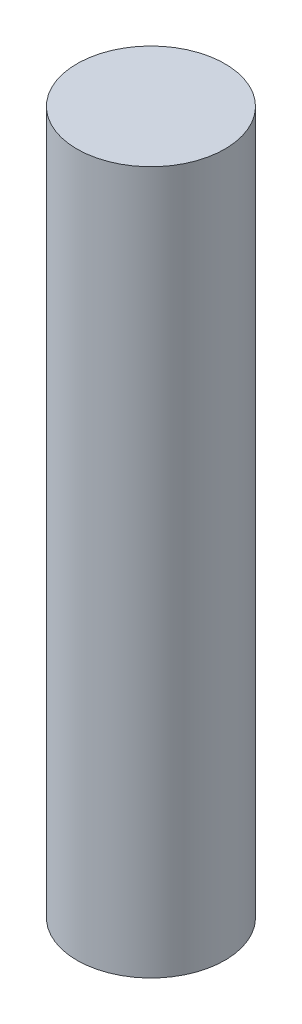
ISO-10303-21;
HEADER;
FILE_DESCRIPTION(('STEP AP214'),'2;1');
FILE_NAME('part.step','',(''),(''),'','','');
FILE_SCHEMA(('AUTOMOTIVE_DESIGN { 1 0 10303 214 1 1 1 1 }'));
ENDSEC;
DATA;
#1=APPLICATION_CONTEXT('core data for automotive mechanical design processes');
#2=APPLICATION_PROTOCOL_DEFINITION('international standard','automotive_design',2000,#1);
#3=PRODUCT_CONTEXT('',#1,'mechanical');
#4=PRODUCT('Part','Part','',(#3));
#5=PRODUCT_RELATED_PRODUCT_CATEGORY('part','',(#4));
#6=PRODUCT_DEFINITION_FORMATION('','',#4);
#7=PRODUCT_DEFINITION_CONTEXT('part definition',#1,'design');
#8=PRODUCT_DEFINITION('design','',#6,#7);
#9=PRODUCT_DEFINITION_SHAPE('','',#8);
#10=(LENGTH_UNIT() NAMED_UNIT(*) SI_UNIT(.MILLI.,.METRE.));
#11=(NAMED_UNIT(*) PLANE_ANGLE_UNIT() SI_UNIT($,.RADIAN.));
#12=(NAMED_UNIT(*) SI_UNIT($,.STERADIAN.) SOLID_ANGLE_UNIT());
#13=UNCERTAINTY_MEASURE_WITH_UNIT(LENGTH_MEASURE(1.E-05),#10,'distance_accuracy_value','');
#14=(GEOMETRIC_REPRESENTATION_CONTEXT(3) GLOBAL_UNCERTAINTY_ASSIGNED_CONTEXT((#13)) GLOBAL_UNIT_ASSIGNED_CONTEXT((#10,
#11,#12)) REPRESENTATION_CONTEXT('',''));
#15=CARTESIAN_POINT('',(0.,0.,0.));
#16=DIRECTION('',(0.,0.,1.));
#17=DIRECTION('',(1.,0.,0.));
#18=AXIS2_PLACEMENT_3D('',#15,#16,#17);
#19=CARTESIAN_POINT('',(0.,19.,0.));
#20=DIRECTION('',(0.,-1.,0.));
#21=DIRECTION('',(0.,0.,-1.));
#22=AXIS2_PLACEMENT_3D('',#19,#20,#21);
#23=CYLINDRICAL_SURFACE('',#22,4.);
#24=CARTESIAN_POINT('',(0.,19.,0.));
#25=DIRECTION('',(0.,1.,0.));
#26=DIRECTION('',(0.,0.,1.));
#27=AXIS2_PLACEMENT_3D('',#24,#25,#26);
#28=CIRCLE('',#27,4.);
#29=CARTESIAN_POINT('',(0.,19.,4.));
#30=VERTEX_POINT('',#29);
#31=EDGE_CURVE('E10',#30,#30,#28,.T.);
#32=ORIENTED_EDGE('',*,*,#31,.F.);
#33=EDGE_LOOP('',(#32));
#34=FACE_BOUND('',#33,.T.);
#35=CARTESIAN_POINT('',(0.,-19.,0.));
#36=DIRECTION('',(0.,1.,0.));
#37=DIRECTION('',(0.,0.,1.));
#38=AXIS2_PLACEMENT_3D('',#35,#36,#37);
#39=CIRCLE('',#38,4.);
#40=CARTESIAN_POINT('',(0.,-19.,4.));
#41=VERTEX_POINT('',#40);
#42=EDGE_CURVE('E34',#41,#41,#39,.T.);
#43=ORIENTED_EDGE('',*,*,#42,.T.);
#44=EDGE_LOOP('',(#43));
#45=FACE_BOUND('',#44,.T.);
#46=ADVANCED_FACE('F31',(#34,#45),#23,.T.);
#47=CARTESIAN_POINT('',(0.,19.,0.));
#48=DIRECTION('',(0.,1.,0.));
#49=DIRECTION('',(0.,0.,1.));
#50=AXIS2_PLACEMENT_3D('',#47,#48,#49);
#51=PLANE('',#50);
#52=ORIENTED_EDGE('',*,*,#31,.T.);
#53=EDGE_LOOP('',(#52));
#54=FACE_BOUND('',#53,.T.);
#55=ADVANCED_FACE('F46',(#54),#51,.T.);
#56=CARTESIAN_POINT('',(0.,-19.,0.));
#57=DIRECTION('',(0.,1.,0.));
#58=DIRECTION('',(0.,0.,1.));
#59=AXIS2_PLACEMENT_3D('',#56,#57,#58);
#60=PLANE('',#59);
#61=ORIENTED_EDGE('',*,*,#42,.F.);
#62=EDGE_LOOP('',(#61));
#63=FACE_BOUND('',#62,.T.);
#64=ADVANCED_FACE('F44',(#63),#60,.F.);
#65=CLOSED_SHELL('',(#46,#55,#64));
#66=MANIFOLD_SOLID_BREP('B2',#65);
#67=ADVANCED_BREP_SHAPE_REPRESENTATION('',(#18,#66),#14);
#68=SHAPE_DEFINITION_REPRESENTATION(#9,#67);
ENDSEC;
END-ISO-10303-21;
